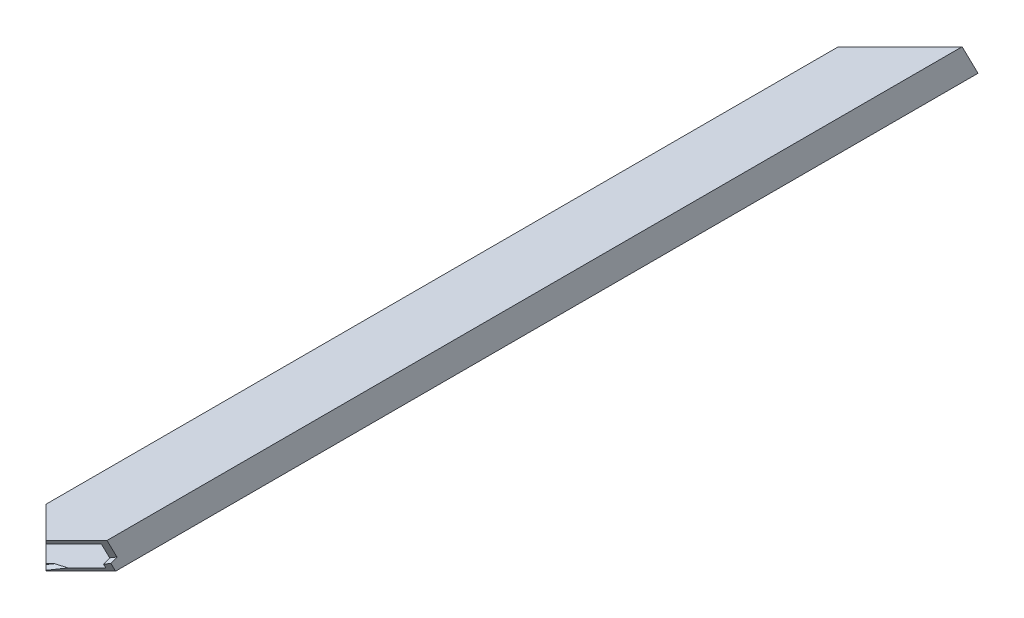
ISO-10303-21;
HEADER;
FILE_DESCRIPTION(('STEP AP214'),'2;1');
FILE_NAME('part.step','',(''),(''),'','','');
FILE_SCHEMA(('AUTOMOTIVE_DESIGN { 1 0 10303 214 1 1 1 1 }'));
ENDSEC;
DATA;
#1=APPLICATION_CONTEXT('core data for automotive mechanical design processes');
#2=APPLICATION_PROTOCOL_DEFINITION('international standard','automotive_design',2000,#1);
#3=PRODUCT_CONTEXT('',#1,'mechanical');
#4=PRODUCT('Part','Part','',(#3));
#5=PRODUCT_RELATED_PRODUCT_CATEGORY('part','',(#4));
#6=PRODUCT_DEFINITION_FORMATION('','',#4);
#7=PRODUCT_DEFINITION_CONTEXT('part definition',#1,'design');
#8=PRODUCT_DEFINITION('design','',#6,#7);
#9=PRODUCT_DEFINITION_SHAPE('','',#8);
#10=(LENGTH_UNIT() NAMED_UNIT(*) SI_UNIT(.MILLI.,.METRE.));
#11=(NAMED_UNIT(*) PLANE_ANGLE_UNIT() SI_UNIT($,.RADIAN.));
#12=(NAMED_UNIT(*) SI_UNIT($,.STERADIAN.) SOLID_ANGLE_UNIT());
#13=UNCERTAINTY_MEASURE_WITH_UNIT(LENGTH_MEASURE(1.E-05),#10,'distance_accuracy_value','');
#14=(GEOMETRIC_REPRESENTATION_CONTEXT(3) GLOBAL_UNCERTAINTY_ASSIGNED_CONTEXT((#13)) GLOBAL_UNIT_ASSIGNED_CONTEXT((#10,
#11,#12)) REPRESENTATION_CONTEXT('',''));
#15=CARTESIAN_POINT('',(0.,0.,0.));
#16=DIRECTION('',(0.,0.,1.));
#17=DIRECTION('',(1.,0.,0.));
#18=AXIS2_PLACEMENT_3D('',#15,#16,#17);
#19=CARTESIAN_POINT('',(324.049085953265,-166.798317971498,324.049085953259));
#20=DIRECTION('',(0.664463024388682,-0.342020143325666,0.664463024388669));
#21=DIRECTION('',(0.707106781186541,0.,-0.707106781186554));
#22=AXIS2_PLACEMENT_3D('',#19,#20,#21);
#23=PLANE('',#22);
#24=DIRECTION('',(0.707106781186541,0.,-0.707106781186554));
#25=VECTOR('',#24,1.);
#26=CARTESIAN_POINT('',(-32.55233747711,-9.525,761.60406252289));
#27=LINE('',#26,#25);
#28=CARTESIAN_POINT('',(-5.35259251704403,-9.52500000000003,734.404317562824));
#29=VERTEX_POINT('',#28);
#30=CARTESIAN_POINT('',(-1.84324537295927,-9.52500000000001,730.894970418739));
#31=VERTEX_POINT('',#30);
#32=EDGE_CURVE('E143',#29,#31,#27,.T.);
#33=ORIENTED_EDGE('',*,*,#32,.F.);
#34=DIRECTION('',(-0.241844762647975,-0.939692620785909,-0.241844762647972));
#35=VECTOR('',#34,1.);
#36=CARTESIAN_POINT('',(-45.829369086669,-166.798317971499,693.927540993199));
#37=LINE('',#36,#35);
#38=CARTESIAN_POINT('',(-5.57591406776472,-10.3927203135477,734.180996012103));
#39=VERTEX_POINT('',#38);
#40=EDGE_CURVE('E133',#29,#39,#37,.T.);
#41=ORIENTED_EDGE('',*,*,#40,.T.);
#42=DIRECTION('',(0.739414642068052,0.171889111388297,-0.65093787759011));
#43=VECTOR('',#42,1.);
#44=CARTESIAN_POINT('',(-31.6491532353195,-16.453874173026,757.134367503583));
#45=LINE('',#44,#43);
#46=EDGE_CURVE('E141',#39,#31,#45,.T.);
#47=ORIENTED_EDGE('',*,*,#46,.T.);
#48=EDGE_LOOP('',(#33,#41,#47));
#49=FACE_BOUND('',#48,.T.);
#50=ADVANCED_FACE('F33',(#49),#23,.T.);
#51=CARTESIAN_POINT('',(-25.4,-12.7,771.9314));
#52=DIRECTION('',(1.,0.,0.));
#53=DIRECTION('',(0.,0.,-1.));
#54=AXIS2_PLACEMENT_3D('',#51,#52,#53);
#55=PLANE('',#54);
#56=DIRECTION('',(0.,-1.,0.));
#57=VECTOR('',#56,1.);
#58=CARTESIAN_POINT('',(-25.4,-12.7,714.356910079868));
#59=LINE('',#58,#57);
#60=CARTESIAN_POINT('',(-25.4,12.7,714.356910079868));
#61=VERTEX_POINT('',#60);
#62=CARTESIAN_POINT('',(-25.4,-12.7,714.356910079868));
#63=VERTEX_POINT('',#62);
#64=EDGE_CURVE('E145',#61,#63,#59,.T.);
#65=ORIENTED_EDGE('',*,*,#64,.F.);
#66=DIRECTION('',(0.,0.,-1.));
#67=VECTOR('',#66,1.);
#68=CARTESIAN_POINT('',(-25.4,12.7,771.9314));
#69=LINE('',#68,#67);
#70=CARTESIAN_POINT('',(-25.4,12.7,63.8741836966249));
#71=VERTEX_POINT('',#70);
#72=EDGE_CURVE('E217',#61,#71,#69,.T.);
#73=ORIENTED_EDGE('',*,*,#72,.T.);
#74=DIRECTION('',(0.,0.88912649071599,0.45766153815573));
#75=VECTOR('',#74,1.);
#76=CARTESIAN_POINT('',(-25.4,280.74206624999,201.84391647517));
#77=LINE('',#76,#75);
#78=CARTESIAN_POINT('',(-25.3999999999998,-12.7,50.8000000000007));
#79=VERTEX_POINT('',#78);
#80=EDGE_CURVE('E196',#79,#71,#77,.T.);
#81=ORIENTED_EDGE('',*,*,#80,.F.);
#82=DIRECTION('',(0.,0.,-1.));
#83=VECTOR('',#82,1.);
#84=CARTESIAN_POINT('',(-25.4,-12.7,771.9314));
#85=LINE('',#84,#83);
#86=EDGE_CURVE('E215',#63,#79,#85,.T.);
#87=ORIENTED_EDGE('',*,*,#86,.F.);
#88=EDGE_LOOP('',(#65,#73,#81,#87));
#89=FACE_BOUND('',#88,.T.);
#90=ADVANCED_FACE('F268',(#89),#55,.F.);
#91=CARTESIAN_POINT('',(-22.225,-9.525,771.9314));
#92=DIRECTION('',(1.,0.,0.));
#93=DIRECTION('',(0.,0.,-1.));
#94=AXIS2_PLACEMENT_3D('',#91,#92,#93);
#95=PLANE('',#94);
#96=DIRECTION('',(0.,0.,-1.));
#97=VECTOR('',#96,1.);
#98=CARTESIAN_POINT('',(-22.225,9.525,771.9314));
#99=LINE('',#98,#97);
#100=CARTESIAN_POINT('',(-22.225,9.525,717.531910079868));
#101=VERTEX_POINT('',#100);
#102=CARTESIAN_POINT('',(-22.225,9.525,59.0649107345468));
#103=VERTEX_POINT('',#102);
#104=EDGE_CURVE('E205',#101,#103,#99,.T.);
#105=ORIENTED_EDGE('',*,*,#104,.F.);
#106=DIRECTION('',(0.,-1.,0.));
#107=VECTOR('',#106,1.);
#108=CARTESIAN_POINT('',(-22.225,-9.525,717.531910079868));
#109=LINE('',#108,#107);
#110=CARTESIAN_POINT('',(-22.225,-9.525,717.531910079868));
#111=VERTEX_POINT('',#110);
#112=EDGE_CURVE('E248',#101,#111,#109,.T.);
#113=ORIENTED_EDGE('',*,*,#112,.T.);
#114=DIRECTION('',(0.,0.,-1.));
#115=VECTOR('',#114,1.);
#116=CARTESIAN_POINT('',(-22.225,-9.525,771.9314));
#117=LINE('',#116,#115);
#118=CARTESIAN_POINT('',(-22.225,-9.525,49.2592729620788));
#119=VERTEX_POINT('',#118);
#120=EDGE_CURVE('E211',#111,#119,#117,.T.);
#121=ORIENTED_EDGE('',*,*,#120,.T.);
#122=DIRECTION('',(0.,0.88912649071599,0.45766153815573));
#123=VECTOR('',#122,1.);
#124=CARTESIAN_POINT('',(-22.225,284.544017351461,200.62590100691));
#125=LINE('',#124,#123);
#126=EDGE_CURVE('E193',#119,#103,#125,.T.);
#127=ORIENTED_EDGE('',*,*,#126,.T.);
#128=EDGE_LOOP('',(#105,#113,#121,#127));
#129=FACE_BOUND('',#128,.T.);
#130=ADVANCED_FACE('F246',(#129),#95,.T.);
#131=CARTESIAN_POINT('',(-22.225,9.525,771.9314));
#132=DIRECTION('',(0.,-1.,0.));
#133=DIRECTION('',(1.,0.,0.));
#134=AXIS2_PLACEMENT_3D('',#131,#132,#133);
#135=PLANE('',#134);
#136=DIRECTION('',(-0.707106781186541,0.,0.707106781186554));
#137=VECTOR('',#136,1.);
#138=CARTESIAN_POINT('',(-27.6495185908759,9.525,766.506881409124));
#139=LINE('',#138,#137);
#140=CARTESIAN_POINT('',(22.225,9.525,716.632362818247));
#141=VERTEX_POINT('',#140);
#142=CARTESIAN_POINT('',(-0.449773630809988,9.52500000000002,739.307136449058));
#143=VERTEX_POINT('',#142);
#144=EDGE_CURVE('E164',#141,#143,#139,.T.);
#145=ORIENTED_EDGE('',*,*,#144,.T.);
#146=DIRECTION('',(-0.707106781186552,0.,-0.707106781186543));
#147=VECTOR('',#146,1.);
#148=CARTESIAN_POINT('',(4.97474496006603,9.525,744.731655039934));
#149=LINE('',#148,#147);
#150=EDGE_CURVE('E154',#143,#101,#149,.T.);
#151=ORIENTED_EDGE('',*,*,#150,.T.);
#152=ORIENTED_EDGE('',*,*,#104,.T.);
#153=DIRECTION('',(0.707106781186541,0.,-0.707106781186554));
#154=VECTOR('',#153,1.);
#155=CARTESIAN_POINT('',(-378.658244632727,9.52499999999998,415.49815536728));
#156=LINE('',#155,#154);
#157=CARTESIAN_POINT('',(22.225,9.525,14.6149107345459));
#158=VERTEX_POINT('',#157);
#159=EDGE_CURVE('E184',#103,#158,#156,.T.);
#160=ORIENTED_EDGE('',*,*,#159,.T.);
#161=DIRECTION('',(0.,0.,-1.));
#162=VECTOR('',#161,1.);
#163=CARTESIAN_POINT('',(22.225,9.525,771.9314));
#164=LINE('',#163,#162);
#165=EDGE_CURVE('E207',#141,#158,#164,.T.);
#166=ORIENTED_EDGE('',*,*,#165,.F.);
#167=EDGE_LOOP('',(#145,#151,#152,#160,#166));
#168=FACE_BOUND('',#167,.T.);
#169=ADVANCED_FACE('F257',(#168),#135,.T.);
#170=CARTESIAN_POINT('',(-25.4,12.7,771.9314));
#171=DIRECTION('',(0.,-1.,0.));
#172=DIRECTION('',(0.,0.,-1.));
#173=AXIS2_PLACEMENT_3D('',#170,#171,#172);
#174=PLANE('',#173);
#175=DIRECTION('',(-0.707106781186552,0.,-0.707106781186543));
#176=VECTOR('',#175,1.);
#177=CARTESIAN_POINT('',(3.38724496006599,12.7,743.144155039934));
#178=LINE('',#177,#176);
#179=CARTESIAN_POINT('',(0.367362850229105,12.7,740.124272930097));
#180=VERTEX_POINT('',#179);
#181=EDGE_CURVE('E249',#180,#61,#178,.T.);
#182=ORIENTED_EDGE('',*,*,#181,.F.);
#183=DIRECTION('',(-0.707106781186541,0.,0.707106781186554));
#184=VECTOR('',#183,1.);
#185=CARTESIAN_POINT('',(-28.4198821098368,12.7,768.911517890163));
#186=LINE('',#185,#184);
#187=CARTESIAN_POINT('',(25.4,12.7,715.091635780325));
#188=VERTEX_POINT('',#187);
#189=EDGE_CURVE('E41',#188,#180,#186,.T.);
#190=ORIENTED_EDGE('',*,*,#189,.F.);
#191=DIRECTION('',(0.,0.,-1.));
#192=VECTOR('',#191,1.);
#193=CARTESIAN_POINT('',(25.4,12.7,771.9314));
#194=LINE('',#193,#192);
#195=CARTESIAN_POINT('',(25.4000000000002,12.7,13.0741836966238));
#196=VERTEX_POINT('',#195);
#197=EDGE_CURVE('E219',#188,#196,#194,.T.);
#198=ORIENTED_EDGE('',*,*,#197,.T.);
#199=DIRECTION('',(0.707106781186541,0.,-0.707106781186554));
#200=VECTOR('',#199,1.);
#201=CARTESIAN_POINT('',(-501.454200718706,12.7,539.92838441534));
#202=LINE('',#201,#200);
#203=EDGE_CURVE('E181',#71,#196,#202,.T.);
#204=ORIENTED_EDGE('',*,*,#203,.F.);
#205=ORIENTED_EDGE('',*,*,#72,.F.);
#206=EDGE_LOOP('',(#182,#190,#198,#204,#205));
#207=FACE_BOUND('',#206,.T.);
#208=ADVANCED_FACE('F263',(#207),#174,.F.);
#209=CARTESIAN_POINT('',(-22.225,-9.525,771.9314));
#210=DIRECTION('',(0.,1.,0.));
#211=DIRECTION('',(0.,0.,1.));
#212=AXIS2_PLACEMENT_3D('',#209,#210,#211);
#213=PLANE('',#212);
#214=ORIENTED_EDGE('',*,*,#120,.F.);
#215=DIRECTION('',(0.707106781186552,0.,0.707106781186543));
#216=VECTOR('',#215,1.);
#217=CARTESIAN_POINT('',(4.97474496006603,-9.525,744.731655039934));
#218=LINE('',#217,#216);
#219=EDGE_CURVE('E144',#111,#29,#218,.T.);
#220=ORIENTED_EDGE('',*,*,#219,.T.);
#221=ORIENTED_EDGE('',*,*,#32,.T.);
#222=DIRECTION('',(-0.959048948031726,0.,0.283240384266156));
#223=VECTOR('',#222,1.);
#224=CARTESIAN_POINT('',(-31.7370642630299,-9.525,739.723650922465));
#225=LINE('',#224,#223);
#226=CARTESIAN_POINT('',(6.72786460079392,-9.52500000000012,728.363624664661));
#227=VERTEX_POINT('',#226);
#228=EDGE_CURVE('E149',#227,#31,#225,.T.);
#229=ORIENTED_EDGE('',*,*,#228,.F.);
#230=DIRECTION('',(0.707106781186541,0.,-0.707106781186554));
#231=VECTOR('',#230,1.);
#232=CARTESIAN_POINT('',(-29.5324553672723,-9.525,764.623944632728));
#233=LINE('',#232,#231);
#234=CARTESIAN_POINT('',(22.225,-9.52500000000001,712.866489265454));
#235=VERTEX_POINT('',#234);
#236=EDGE_CURVE('E176',#227,#235,#233,.T.);
#237=ORIENTED_EDGE('',*,*,#236,.T.);
#238=DIRECTION('',(0.,0.,-1.));
#239=VECTOR('',#238,1.);
#240=CARTESIAN_POINT('',(22.225,-9.525,771.9314));
#241=LINE('',#240,#239);
#242=CARTESIAN_POINT('',(22.225,-9.52499999999995,4.80927296207803));
#243=VERTEX_POINT('',#242);
#244=EDGE_CURVE('E209',#235,#243,#241,.T.);
#245=ORIENTED_EDGE('',*,*,#244,.T.);
#246=DIRECTION('',(-0.707106781186541,0.,0.707106781186554));
#247=VECTOR('',#246,1.);
#248=CARTESIAN_POINT('',(-383.561063518961,-9.525,410.595336481046));
#249=LINE('',#248,#247);
#250=EDGE_CURVE('E190',#243,#119,#249,.T.);
#251=ORIENTED_EDGE('',*,*,#250,.T.);
#252=EDGE_LOOP('',(#214,#220,#221,#229,#237,#245,#251));
#253=FACE_BOUND('',#252,.T.);
#254=ADVANCED_FACE('F231',(#253),#213,.T.);
#255=CARTESIAN_POINT('',(-25.4,-12.7,771.9314));
#256=DIRECTION('',(0.,1.,0.));
#257=DIRECTION('',(0.,0.,1.));
#258=AXIS2_PLACEMENT_3D('',#255,#256,#257);
#259=PLANE('',#258);
#260=DIRECTION('',(0.707106781186552,0.,0.707106781186543));
#261=VECTOR('',#260,1.);
#262=CARTESIAN_POINT('',(3.38724496006599,-12.7,743.144155039934));
#263=LINE('',#262,#261);
#264=CARTESIAN_POINT('',(-3.14984688824533,-12.7,736.607063191622));
#265=VERTEX_POINT('',#264);
#266=EDGE_CURVE('E277',#63,#265,#263,.T.);
#267=ORIENTED_EDGE('',*,*,#266,.F.);
#268=ORIENTED_EDGE('',*,*,#86,.T.);
#269=DIRECTION('',(0.707106781186541,0.,-0.707106781186554));
#270=VECTOR('',#269,1.);
#271=CARTESIAN_POINT('',(25.4,-12.7,0.));
#272=LINE('',#271,#270);
#273=CARTESIAN_POINT('',(25.4,-12.7,0.));
#274=VERTEX_POINT('',#273);
#275=EDGE_CURVE('E202',#79,#274,#272,.T.);
#276=ORIENTED_EDGE('',*,*,#275,.T.);
#277=DIRECTION('',(0.,0.,-1.));
#278=VECTOR('',#277,1.);
#279=CARTESIAN_POINT('',(25.4,-12.7,771.9314));
#280=LINE('',#279,#278);
#281=CARTESIAN_POINT('',(25.4000000000001,-12.7,708.057216303376));
#282=VERTEX_POINT('',#281);
#283=EDGE_CURVE('E213',#282,#274,#280,.T.);
#284=ORIENTED_EDGE('',*,*,#283,.F.);
#285=DIRECTION('',(0.707106781186541,0.,-0.707106781186554));
#286=VECTOR('',#285,1.);
#287=CARTESIAN_POINT('',(-153.96268441533,-12.7,887.41990071871));
#288=LINE('',#287,#286);
#289=EDGE_CURVE('E171',#265,#282,#288,.T.);
#290=ORIENTED_EDGE('',*,*,#289,.F.);
#291=EDGE_LOOP('',(#267,#268,#276,#284,#290));
#292=FACE_BOUND('',#291,.T.);
#293=ADVANCED_FACE('F275',(#292),#259,.F.);
#294=CARTESIAN_POINT('',(-147.425592567018,12.7,893.956992567022));
#295=DIRECTION('',(0.664463024388682,-0.342020143325665,0.664463024388669));
#296=DIRECTION('',(0.707106781186541,0.,-0.707106781186554));
#297=AXIS2_PLACEMENT_3D('',#294,#295,#296);
#298=PLANE('',#297);
#299=DIRECTION('',(0.739414642068052,0.171889111388297,-0.65093787759011));
#300=VECTOR('',#299,1.);
#301=CARTESIAN_POINT('',(-154.430575889781,-46.9889337018959,870.238193060091));
#302=LINE('',#301,#300);
#303=CARTESIAN_POINT('',(-2.90929105828811,-11.7653155527422,736.847619021579));
#304=VERTEX_POINT('',#303);
#305=EDGE_CURVE('E222',#304,#227,#302,.T.);
#306=ORIENTED_EDGE('',*,*,#305,.F.);
#307=DIRECTION('',(-0.241844762647974,-0.93969262078591,-0.241844762647971));
#308=VECTOR('',#307,1.);
#309=CARTESIAN_POINT('',(3.38724496006676,12.7000000000002,743.144155039934));
#310=LINE('',#309,#308);
#311=EDGE_CURVE('E47',#304,#265,#310,.T.);
#312=ORIENTED_EDGE('',*,*,#311,.T.);
#313=ORIENTED_EDGE('',*,*,#289,.T.);
#314=DIRECTION('',(0.,0.889126490715989,0.457661538155732));
#315=VECTOR('',#314,1.);
#316=CARTESIAN_POINT('',(25.4,13.2916187867686,721.435924909315));
#317=LINE('',#316,#315);
#318=CARTESIAN_POINT('',(25.4000000000001,-5.18435460445475,711.925756795504));
#319=VERTEX_POINT('',#318);
#320=EDGE_CURVE('E178',#282,#319,#317,.T.);
#321=ORIENTED_EDGE('',*,*,#320,.T.);
#322=CARTESIAN_POINT('',(22.225,-5.92243564533248,714.7208431297));
#323=VERTEX_POINT('',#322);
#324=EDGE_CURVE('E221',#323,#319,#302,.T.);
#325=ORIENTED_EDGE('',*,*,#324,.F.);
#326=DIRECTION('',(0.,0.889126490715989,0.457661538155732));
#327=VECTOR('',#326,1.);
#328=CARTESIAN_POINT('',(22.225,14.5096342550281,725.237876010786));
#329=LINE('',#328,#327);
#330=EDGE_CURVE('E173',#235,#323,#329,.T.);
#331=ORIENTED_EDGE('',*,*,#330,.F.);
#332=ORIENTED_EDGE('',*,*,#236,.F.);
#333=EDGE_LOOP('',(#306,#312,#313,#321,#325,#331,#332));
#334=FACE_BOUND('',#333,.T.);
#335=ADVANCED_FACE('F233',(#334),#298,.T.);
#336=ORIENTED_EDGE('',*,*,#189,.T.);
#337=DIRECTION('',(-0.241844762647975,-0.939692620785909,-0.241844762647972));
#338=VECTOR('',#337,1.);
#339=CARTESIAN_POINT('',(-45.829369086669,-166.798317971499,693.927540993199));
#340=LINE('',#339,#338);
#341=EDGE_CURVE('E254',#180,#143,#340,.T.);
#342=ORIENTED_EDGE('',*,*,#341,.T.);
#343=ORIENTED_EDGE('',*,*,#144,.F.);
#344=DIRECTION('',(0.,0.889126490715988,0.457661538155733));
#345=VECTOR('',#344,1.);
#346=CARTESIAN_POINT('',(22.225,16.9673290555655,720.463165070341));
#347=LINE('',#346,#345);
#348=CARTESIAN_POINT('',(22.225,-3.9299399694567,709.706679480148));
#349=VERTEX_POINT('',#348);
#350=EDGE_CURVE('E167',#349,#141,#347,.T.);
#351=ORIENTED_EDGE('',*,*,#350,.F.);
#352=CARTESIAN_POINT('',(25.4,-3.19185892857895,706.911593145952));
#353=VERTEX_POINT('',#352);
#354=EDGE_CURVE('E150',#349,#353,#45,.T.);
#355=ORIENTED_EDGE('',*,*,#354,.T.);
#356=DIRECTION('',(0.,0.889126490715988,0.457661538155733));
#357=VECTOR('',#356,1.);
#358=CARTESIAN_POINT('',(25.4,15.7493135873061,716.661213968871));
#359=LINE('',#358,#357);
#360=EDGE_CURVE('E162',#353,#188,#359,.T.);
#361=ORIENTED_EDGE('',*,*,#360,.T.);
#362=EDGE_LOOP('',(#336,#342,#343,#351,#355,#361));
#363=FACE_BOUND('',#362,.T.);
#364=ADVANCED_FACE('F284',(#363),#23,.T.);
#365=CARTESIAN_POINT('',(-31.6491532353195,-16.453874173026,757.134367503583));
#366=DIRECTION('',(-0.108419907376925,-0.923837840178477,-0.367108660669761));
#367=DIRECTION('',(0.,0.369285529650164,-0.929315983716517));
#368=AXIS2_PLACEMENT_3D('',#365,#366,#367);
#369=PLANE('',#368);
#370=DIRECTION('',(-0.66446302438868,0.342020143325666,-0.664463024388671));
#371=VECTOR('',#370,1.);
#372=CARTESIAN_POINT('',(-5.57591406776465,-10.3927203135477,734.180996012103));
#373=LINE('',#372,#371);
#374=EDGE_CURVE('E11',#304,#39,#373,.T.);
#375=ORIENTED_EDGE('',*,*,#374,.F.);
#376=ORIENTED_EDGE('',*,*,#305,.T.);
#377=ORIENTED_EDGE('',*,*,#228,.T.);
#378=ORIENTED_EDGE('',*,*,#46,.F.);
#379=EDGE_LOOP('',(#375,#376,#377,#378));
#380=FACE_BOUND('',#379,.T.);
#381=ADVANCED_FACE('F147',(#380),#369,.F.);
#382=CARTESIAN_POINT('',(25.4,-12.7,771.9314));
#383=DIRECTION('',(-1.,0.,0.));
#384=DIRECTION('',(0.,0.,1.));
#385=AXIS2_PLACEMENT_3D('',#382,#383,#384);
#386=PLANE('',#385);
#387=ORIENTED_EDGE('',*,*,#360,.F.);
#388=DIRECTION('',(0.,-0.369285529650164,0.929315983716517));
#389=VECTOR('',#388,1.);
#390=CARTESIAN_POINT('',(25.4,-26.8021900803987,766.327563603858));
#391=LINE('',#390,#389);
#392=EDGE_CURVE('E159',#353,#319,#391,.T.);
#393=ORIENTED_EDGE('',*,*,#392,.T.);
#394=ORIENTED_EDGE('',*,*,#320,.F.);
#395=ORIENTED_EDGE('',*,*,#283,.T.);
#396=DIRECTION('',(0.,-0.88912649071599,-0.45766153815573));
#397=VECTOR('',#396,1.);
#398=CARTESIAN_POINT('',(25.4,301.41355131568,161.684183917328));
#399=LINE('',#398,#397);
#400=EDGE_CURVE('E199',#196,#274,#399,.T.);
#401=ORIENTED_EDGE('',*,*,#400,.F.);
#402=ORIENTED_EDGE('',*,*,#197,.F.);
#403=EDGE_LOOP('',(#387,#393,#394,#395,#401,#402));
#404=FACE_BOUND('',#403,.T.);
#405=ADVANCED_FACE('F35',(#404),#386,.F.);
#406=CARTESIAN_POINT('',(22.225,-9.525,771.9314));
#407=DIRECTION('',(-1.,0.,0.));
#408=DIRECTION('',(0.,-1.,0.));
#409=AXIS2_PLACEMENT_3D('',#406,#407,#408);
#410=PLANE('',#409);
#411=DIRECTION('',(0.,-0.369285529650164,0.929315983716517));
#412=VECTOR('',#411,1.);
#413=CARTESIAN_POINT('',(22.225,-26.0474112463367,765.365831888495));
#414=LINE('',#413,#412);
#415=EDGE_CURVE('E55',#349,#323,#414,.T.);
#416=ORIENTED_EDGE('',*,*,#415,.F.);
#417=ORIENTED_EDGE('',*,*,#350,.T.);
#418=ORIENTED_EDGE('',*,*,#165,.T.);
#419=DIRECTION('',(0.,-0.88912649071599,-0.45766153815573));
#420=VECTOR('',#419,1.);
#421=CARTESIAN_POINT('',(22.2249999999999,302.631566783939,165.486135018799));
#422=LINE('',#421,#420);
#423=EDGE_CURVE('E187',#158,#243,#422,.T.);
#424=ORIENTED_EDGE('',*,*,#423,.T.);
#425=ORIENTED_EDGE('',*,*,#244,.F.);
#426=ORIENTED_EDGE('',*,*,#330,.T.);
#427=EDGE_LOOP('',(#416,#417,#418,#424,#425,#426));
#428=FACE_BOUND('',#427,.T.);
#429=ADVANCED_FACE('F236',(#428),#410,.T.);
#430=CARTESIAN_POINT('',(-501.454200718706,12.7,539.92838441534));
#431=DIRECTION('',(-0.664463024388683,0.342020143325663,-0.66446302438867));
#432=DIRECTION('',(-0.707106781186541,0.,0.707106781186554));
#433=AXIS2_PLACEMENT_3D('',#430,#431,#432);
#434=PLANE('',#433);
#435=ORIENTED_EDGE('',*,*,#250,.F.);
#436=ORIENTED_EDGE('',*,*,#423,.F.);
#437=ORIENTED_EDGE('',*,*,#159,.F.);
#438=ORIENTED_EDGE('',*,*,#126,.F.);
#439=EDGE_LOOP('',(#435,#436,#437,#438));
#440=FACE_BOUND('',#439,.T.);
#441=ORIENTED_EDGE('',*,*,#400,.T.);
#442=ORIENTED_EDGE('',*,*,#275,.F.);
#443=ORIENTED_EDGE('',*,*,#80,.T.);
#444=ORIENTED_EDGE('',*,*,#203,.T.);
#445=EDGE_LOOP('',(#441,#442,#443,#444));
#446=FACE_BOUND('',#445,.T.);
#447=ADVANCED_FACE('F241',(#440,#446),#434,.T.);
#448=ORIENTED_EDGE('',*,*,#354,.F.);
#449=ORIENTED_EDGE('',*,*,#415,.T.);
#450=ORIENTED_EDGE('',*,*,#324,.T.);
#451=ORIENTED_EDGE('',*,*,#392,.F.);
#452=EDGE_LOOP('',(#448,#449,#450,#451));
#453=FACE_BOUND('',#452,.T.);
#454=ADVANCED_FACE('F283',(#453),#369,.F.);
#455=CARTESIAN_POINT('',(-369.878455039934,0.,369.878455039939));
#456=DIRECTION('',(-0.707106781186543,0.,0.707106781186552));
#457=DIRECTION('',(0.707106781186552,0.,0.707106781186543));
#458=AXIS2_PLACEMENT_3D('',#455,#456,#457);
#459=PLANE('',#458);
#460=ORIENTED_EDGE('',*,*,#341,.F.);
#461=ORIENTED_EDGE('',*,*,#181,.T.);
#462=ORIENTED_EDGE('',*,*,#64,.T.);
#463=ORIENTED_EDGE('',*,*,#266,.T.);
#464=ORIENTED_EDGE('',*,*,#311,.F.);
#465=ORIENTED_EDGE('',*,*,#374,.T.);
#466=ORIENTED_EDGE('',*,*,#40,.F.);
#467=ORIENTED_EDGE('',*,*,#219,.F.);
#468=ORIENTED_EDGE('',*,*,#112,.F.);
#469=ORIENTED_EDGE('',*,*,#150,.F.);
#470=EDGE_LOOP('',(#460,#461,#462,#463,#464,#465,#466,#467,#468,#469));
#471=FACE_BOUND('',#470,.T.);
#472=ADVANCED_FACE('F132',(#471),#459,.T.);
#473=CLOSED_SHELL('',(#50,#90,#130,#169,#208,#254,#293,#335,#364,#381,#405,#429,#447,#454,#472));
#474=MANIFOLD_SOLID_BREP('B2',#473);
#475=ADVANCED_BREP_SHAPE_REPRESENTATION('',(#18,#474),#14);
#476=SHAPE_DEFINITION_REPRESENTATION(#9,#475);
ENDSEC;
END-ISO-10303-21;
